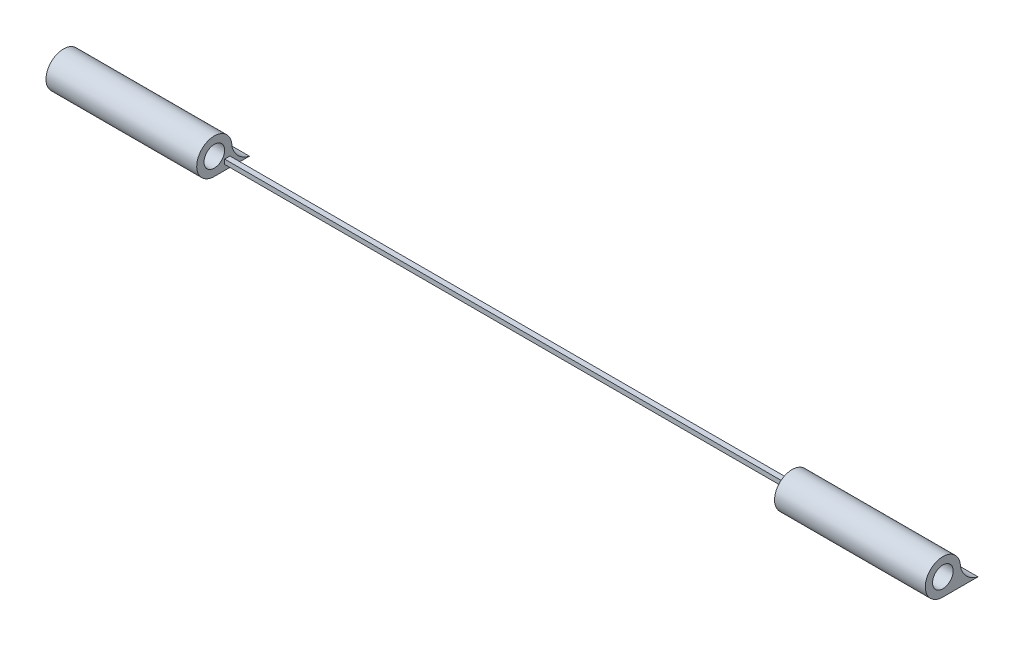
ISO-10303-21;
HEADER;
FILE_DESCRIPTION(('STEP AP214'),'2;1');
FILE_NAME('part.step','',(''),(''),'','','');
FILE_SCHEMA(('AUTOMOTIVE_DESIGN { 1 0 10303 214 1 1 1 1 }'));
ENDSEC;
DATA;
#1=APPLICATION_CONTEXT('core data for automotive mechanical design processes');
#2=APPLICATION_PROTOCOL_DEFINITION('international standard','automotive_design',2000,#1);
#3=PRODUCT_CONTEXT('',#1,'mechanical');
#4=PRODUCT('Part','Part','',(#3));
#5=PRODUCT_RELATED_PRODUCT_CATEGORY('part','',(#4));
#6=PRODUCT_DEFINITION_FORMATION('','',#4);
#7=PRODUCT_DEFINITION_CONTEXT('part definition',#1,'design');
#8=PRODUCT_DEFINITION('design','',#6,#7);
#9=PRODUCT_DEFINITION_SHAPE('','',#8);
#10=(LENGTH_UNIT() NAMED_UNIT(*) SI_UNIT(.MILLI.,.METRE.));
#11=(NAMED_UNIT(*) PLANE_ANGLE_UNIT() SI_UNIT($,.RADIAN.));
#12=(NAMED_UNIT(*) SI_UNIT($,.STERADIAN.) SOLID_ANGLE_UNIT());
#13=UNCERTAINTY_MEASURE_WITH_UNIT(LENGTH_MEASURE(1.E-05),#10,'distance_accuracy_value','');
#14=(GEOMETRIC_REPRESENTATION_CONTEXT(3) GLOBAL_UNCERTAINTY_ASSIGNED_CONTEXT((#13)) GLOBAL_UNIT_ASSIGNED_CONTEXT((#10,
#11,#12)) REPRESENTATION_CONTEXT('',''));
#15=CARTESIAN_POINT('',(0.,0.,0.));
#16=DIRECTION('',(0.,0.,1.));
#17=DIRECTION('',(1.,0.,0.));
#18=AXIS2_PLACEMENT_3D('',#15,#16,#17);
#19=CARTESIAN_POINT('',(-48.,0.,0.));
#20=DIRECTION('',(1.,0.,0.));
#21=DIRECTION('',(0.,0.,-1.));
#22=AXIS2_PLACEMENT_3D('',#19,#20,#21);
#23=PLANE('',#22);
#24=CARTESIAN_POINT('',(-48.,2.69861313868613,72.1941406768414));
#25=DIRECTION('',(1.,0.,0.));
#26=DIRECTION('',(0.,0.,-1.));
#27=AXIS2_PLACEMENT_3D('',#24,#25,#26);
#28=CIRCLE('',#27,0.700000000000002);
#29=CARTESIAN_POINT('',(-48.,2.00032979553038,72.1451470785736));
#30=VERTEX_POINT('',#29);
#31=CARTESIAN_POINT('',(-48.,2.69861313868613,71.4941406768414));
#32=VERTEX_POINT('',#31);
#33=EDGE_CURVE('E47',#30,#32,#28,.F.);
#34=ORIENTED_EDGE('',*,*,#33,.T.);
#35=CARTESIAN_POINT('',(-48.,2.89930656934307,70.5948341074983));
#36=DIRECTION('',(1.,0.,0.));
#37=DIRECTION('',(0.,0.,-1.));
#38=AXIS2_PLACEMENT_3D('',#35,#36,#37);
#39=CIRCLE('',#38,0.921428325358213);
#40=CARTESIAN_POINT('',(-48.,2.,70.7955275381552));
#41=VERTEX_POINT('',#40);
#42=EDGE_CURVE('E211',#32,#41,#39,.T.);
#43=ORIENTED_EDGE('',*,*,#42,.T.);
#44=DIRECTION('',(0.,0.,1.));
#45=VECTOR('',#44,1.);
#46=CARTESIAN_POINT('',(-48.,2.,0.));
#47=LINE('',#46,#45);
#48=CARTESIAN_POINT('',(-48.,2.,72.1451239391562));
#49=VERTEX_POINT('',#48);
#50=EDGE_CURVE('E219',#41,#49,#47,.T.);
#51=ORIENTED_EDGE('',*,*,#50,.T.);
#52=DIRECTION('',(0.,-0.997547633079647,-0.0699908546682587));
#53=VECTOR('',#52,1.);
#54=CARTESIAN_POINT('',(-48.,-5.02731822114554,71.6520667737501));
#55=LINE('',#54,#53);
#56=EDGE_CURVE('E220',#30,#49,#55,.T.);
#57=ORIENTED_EDGE('',*,*,#56,.F.);
#58=EDGE_LOOP('',(#34,#43,#51,#57));
#59=FACE_BOUND('',#58,.T.);
#60=CARTESIAN_POINT('',(-48.,2.69861313868613,72.1941406768414));
#61=DIRECTION('',(1.,0.,0.));
#62=DIRECTION('',(0.,0.,-1.));
#63=AXIS2_PLACEMENT_3D('',#60,#61,#62);
#64=CIRCLE('',#63,0.409999999999988);
#65=CARTESIAN_POINT('',(-48.,2.69861313868613,71.7841406768414));
#66=VERTEX_POINT('',#65);
#67=EDGE_CURVE('E207',#66,#66,#64,.T.);
#68=ORIENTED_EDGE('',*,*,#67,.T.);
#69=EDGE_LOOP('',(#68));
#70=FACE_BOUND('',#69,.T.);
#71=ADVANCED_FACE('F43',(#59,#70),#23,.F.);
#72=CARTESIAN_POINT('',(-4.99999999999999,2.69861313868613,72.1941406768414));
#73=DIRECTION('',(-1.,0.,0.));
#74=DIRECTION('',(0.,0.,1.));
#75=AXIS2_PLACEMENT_3D('',#72,#73,#74);
#76=CYLINDRICAL_SURFACE('',#75,0.700000000000002);
#77=ORIENTED_EDGE('',*,*,#33,.F.);
#78=DIRECTION('',(-1.,0.,0.));
#79=VECTOR('',#78,1.);
#80=CARTESIAN_POINT('',(-4.99999999999999,2.00032979553038,72.1451470785736));
#81=LINE('',#80,#79);
#82=CARTESIAN_POINT('',(-42.,2.00032979553038,72.1451470785736));
#83=VERTEX_POINT('',#82);
#84=EDGE_CURVE('E208',#83,#30,#81,.T.);
#85=ORIENTED_EDGE('',*,*,#84,.F.);
#86=CARTESIAN_POINT('',(-42.,2.69861313868613,72.1941406768414));
#87=DIRECTION('',(1.,0.,0.));
#88=DIRECTION('',(0.,0.,-1.));
#89=AXIS2_PLACEMENT_3D('',#86,#87,#88);
#90=CIRCLE('',#89,0.700000000000002);
#91=CARTESIAN_POINT('',(-42.,2.69861313868613,71.4941406768414));
#92=VERTEX_POINT('',#91);
#93=EDGE_CURVE('E11',#83,#92,#90,.F.);
#94=ORIENTED_EDGE('',*,*,#93,.T.);
#95=DIRECTION('',(-1.,0.,0.));
#96=VECTOR('',#95,1.);
#97=CARTESIAN_POINT('',(-4.99999999999999,2.69861313868613,71.4941406768414));
#98=LINE('',#97,#96);
#99=EDGE_CURVE('E213',#92,#32,#98,.T.);
#100=ORIENTED_EDGE('',*,*,#99,.T.);
#101=EDGE_LOOP('',(#77,#85,#94,#100));
#102=FACE_BOUND('',#101,.T.);
#103=ADVANCED_FACE('F251',(#102),#76,.T.);
#104=CARTESIAN_POINT('',(-42.,0.,0.));
#105=DIRECTION('',(1.,0.,0.));
#106=DIRECTION('',(0.,0.,-1.));
#107=AXIS2_PLACEMENT_3D('',#104,#105,#106);
#108=PLANE('',#107);
#109=ORIENTED_EDGE('',*,*,#93,.F.);
#110=DIRECTION('',(0.,-0.997547633079647,-0.0699908546682587));
#111=VECTOR('',#110,1.);
#112=CARTESIAN_POINT('',(-42.,-5.02731822114554,71.6520667737501));
#113=LINE('',#112,#111);
#114=CARTESIAN_POINT('',(-42.,2.,72.1451239391562));
#115=VERTEX_POINT('',#114);
#116=EDGE_CURVE('E226',#83,#115,#113,.T.);
#117=ORIENTED_EDGE('',*,*,#116,.T.);
#118=DIRECTION('',(0.,0.,1.));
#119=VECTOR('',#118,1.);
#120=CARTESIAN_POINT('',(-42.,2.,0.));
#121=LINE('',#120,#119);
#122=CARTESIAN_POINT('',(-42.,2.,70.7955275381552));
#123=VERTEX_POINT('',#122);
#124=EDGE_CURVE('E184',#123,#115,#121,.T.);
#125=ORIENTED_EDGE('',*,*,#124,.F.);
#126=CARTESIAN_POINT('',(-42.,2.89930656934307,70.5948341074983));
#127=DIRECTION('',(1.,0.,0.));
#128=DIRECTION('',(0.,0.,-1.));
#129=AXIS2_PLACEMENT_3D('',#126,#127,#128);
#130=CIRCLE('',#129,0.921428325358213);
#131=EDGE_CURVE('E223',#92,#123,#130,.T.);
#132=ORIENTED_EDGE('',*,*,#131,.F.);
#133=EDGE_LOOP('',(#109,#117,#125,#132));
#134=FACE_BOUND('',#133,.T.);
#135=CARTESIAN_POINT('',(-42.,2.69861313868613,72.1941406768414));
#136=DIRECTION('',(1.,0.,0.));
#137=DIRECTION('',(0.,0.,-1.));
#138=AXIS2_PLACEMENT_3D('',#135,#136,#137);
#139=CIRCLE('',#138,0.409999999999988);
#140=CARTESIAN_POINT('',(-42.,2.69861313868613,71.7841406768414));
#141=VERTEX_POINT('',#140);
#142=EDGE_CURVE('E204',#141,#141,#139,.T.);
#143=ORIENTED_EDGE('',*,*,#142,.F.);
#144=EDGE_LOOP('',(#143));
#145=FACE_BOUND('',#144,.T.);
#146=DIRECTION('',(0.,-1.,0.));
#147=VECTOR('',#146,1.);
#148=CARTESIAN_POINT('',(-42.,2.39497961892927,71.7841406768414));
#149=LINE('',#148,#147);
#150=CARTESIAN_POINT('',(-42.,2.39497961892927,71.7841406768414));
#151=VERTEX_POINT('',#150);
#152=CARTESIAN_POINT('',(-42.,2.21138820541952,71.7841406768414));
#153=VERTEX_POINT('',#152);
#154=EDGE_CURVE('E168',#151,#153,#149,.T.);
#155=ORIENTED_EDGE('',*,*,#154,.F.);
#156=DIRECTION('',(0.,0.,1.));
#157=VECTOR('',#156,1.);
#158=CARTESIAN_POINT('',(-42.,2.39497961892927,71.7841406768414));
#159=LINE('',#158,#157);
#160=CARTESIAN_POINT('',(-42.,2.39497961892927,71.5729544581436));
#161=VERTEX_POINT('',#160);
#162=EDGE_CURVE('E58',#161,#151,#159,.T.);
#163=ORIENTED_EDGE('',*,*,#162,.F.);
#164=DIRECTION('',(0.,1.,0.));
#165=VECTOR('',#164,1.);
#166=CARTESIAN_POINT('',(-42.,2.39497961892927,71.5729544581436));
#167=LINE('',#166,#165);
#168=CARTESIAN_POINT('',(-42.,2.21138820541952,71.5729544581436));
#169=VERTEX_POINT('',#168);
#170=EDGE_CURVE('E190',#169,#161,#167,.T.);
#171=ORIENTED_EDGE('',*,*,#170,.F.);
#172=DIRECTION('',(0.,0.,-1.));
#173=VECTOR('',#172,1.);
#174=CARTESIAN_POINT('',(-42.,2.21138820541952,71.7841406768414));
#175=LINE('',#174,#173);
#176=EDGE_CURVE('E187',#153,#169,#175,.T.);
#177=ORIENTED_EDGE('',*,*,#176,.F.);
#178=EDGE_LOOP('',(#155,#163,#171,#177));
#179=FACE_BOUND('',#178,.T.);
#180=ADVANCED_FACE('F45',(#134,#145,#179),#108,.T.);
#181=CARTESIAN_POINT('',(0.,2.,0.));
#182=DIRECTION('',(0.,1.,0.));
#183=DIRECTION('',(0.,0.,1.));
#184=AXIS2_PLACEMENT_3D('',#181,#182,#183);
#185=PLANE('',#184);
#186=DIRECTION('',(-1.,0.,0.));
#187=VECTOR('',#186,1.);
#188=CARTESIAN_POINT('',(-4.99999999999999,2.,70.7955275381552));
#189=LINE('',#188,#187);
#190=EDGE_CURVE('E212',#123,#41,#189,.T.);
#191=ORIENTED_EDGE('',*,*,#190,.F.);
#192=ORIENTED_EDGE('',*,*,#124,.T.);
#193=DIRECTION('',(-1.,0.,0.));
#194=VECTOR('',#193,1.);
#195=CARTESIAN_POINT('',(-4.99999999999999,2.,72.1451239391562));
#196=LINE('',#195,#194);
#197=EDGE_CURVE('E216',#115,#49,#196,.T.);
#198=ORIENTED_EDGE('',*,*,#197,.T.);
#199=ORIENTED_EDGE('',*,*,#50,.F.);
#200=EDGE_LOOP('',(#191,#192,#198,#199));
#201=FACE_BOUND('',#200,.T.);
#202=ADVANCED_FACE('F238',(#201),#185,.F.);
#203=CARTESIAN_POINT('',(-56.,2.69861313868613,72.1941406768414));
#204=DIRECTION('',(1.,0.,0.));
#205=DIRECTION('',(0.,0.,-1.));
#206=AXIS2_PLACEMENT_3D('',#203,#204,#205);
#207=CYLINDRICAL_SURFACE('',#206,0.409999999999988);
#208=ORIENTED_EDGE('',*,*,#142,.T.);
#209=EDGE_LOOP('',(#208));
#210=FACE_BOUND('',#209,.T.);
#211=ORIENTED_EDGE('',*,*,#67,.F.);
#212=EDGE_LOOP('',(#211));
#213=FACE_BOUND('',#212,.T.);
#214=ADVANCED_FACE('F260',(#210,#213),#207,.F.);
#215=CARTESIAN_POINT('',(-4.99999999999999,2.89930656934307,70.5948341074983));
#216=DIRECTION('',(-1.,0.,0.));
#217=DIRECTION('',(0.,0.,1.));
#218=AXIS2_PLACEMENT_3D('',#215,#216,#217);
#219=CYLINDRICAL_SURFACE('',#218,0.921428325358213);
#220=ORIENTED_EDGE('',*,*,#42,.F.);
#221=ORIENTED_EDGE('',*,*,#99,.F.);
#222=ORIENTED_EDGE('',*,*,#131,.T.);
#223=ORIENTED_EDGE('',*,*,#190,.T.);
#224=EDGE_LOOP('',(#220,#221,#222,#223));
#225=FACE_BOUND('',#224,.T.);
#226=ADVANCED_FACE('F248',(#225),#219,.F.);
#227=CARTESIAN_POINT('',(-5.,1.00278216245073,72.0751562239053));
#228=DIRECTION('',(0.,-0.0699908546682587,0.997547633079647));
#229=DIRECTION('',(0.,-0.997547633079647,-0.0699908546682587));
#230=AXIS2_PLACEMENT_3D('',#227,#228,#229);
#231=PLANE('',#230);
#232=ORIENTED_EDGE('',*,*,#56,.T.);
#233=ORIENTED_EDGE('',*,*,#197,.F.);
#234=ORIENTED_EDGE('',*,*,#116,.F.);
#235=ORIENTED_EDGE('',*,*,#84,.T.);
#236=EDGE_LOOP('',(#232,#233,#234,#235));
#237=FACE_BOUND('',#236,.T.);
#238=ADVANCED_FACE('F242',(#237),#231,.T.);
#239=CARTESIAN_POINT('',(-18.7201689329571,2.39497961892927,71.7841406768414));
#240=DIRECTION('',(0.,-1.,0.));
#241=DIRECTION('',(0.,0.,-1.));
#242=AXIS2_PLACEMENT_3D('',#239,#240,#241);
#243=PLANE('',#242);
#244=DIRECTION('',(-1.,0.,0.));
#245=VECTOR('',#244,1.);
#246=CARTESIAN_POINT('',(-18.7201689329571,2.39497961892927,71.7841406768414));
#247=LINE('',#246,#245);
#248=CARTESIAN_POINT('',(-19.,2.39497961892927,71.7841406768414));
#249=VERTEX_POINT('',#248);
#250=EDGE_CURVE('E194',#249,#151,#247,.T.);
#251=ORIENTED_EDGE('',*,*,#250,.F.);
#252=DIRECTION('',(0.,0.,-1.));
#253=VECTOR('',#252,1.);
#254=CARTESIAN_POINT('',(-19.,2.39497961892927,71.7841406768414));
#255=LINE('',#254,#253);
#256=CARTESIAN_POINT('',(-19.,2.39497961892927,71.5729544581436));
#257=VERTEX_POINT('',#256);
#258=EDGE_CURVE('E178',#249,#257,#255,.T.);
#259=ORIENTED_EDGE('',*,*,#258,.T.);
#260=DIRECTION('',(-1.,0.,0.));
#261=VECTOR('',#260,1.);
#262=CARTESIAN_POINT('',(-18.7201689329571,2.39497961892927,71.5729544581436));
#263=LINE('',#262,#261);
#264=EDGE_CURVE('E196',#257,#161,#263,.T.);
#265=ORIENTED_EDGE('',*,*,#264,.T.);
#266=ORIENTED_EDGE('',*,*,#162,.T.);
#267=EDGE_LOOP('',(#251,#259,#265,#266));
#268=FACE_BOUND('',#267,.T.);
#269=ADVANCED_FACE('F264',(#268),#243,.F.);
#270=CARTESIAN_POINT('',(-18.7201689329571,2.39497961892927,71.5729544581436));
#271=DIRECTION('',(0.,0.,1.));
#272=DIRECTION('',(1.,0.,0.));
#273=AXIS2_PLACEMENT_3D('',#270,#271,#272);
#274=PLANE('',#273);
#275=ORIENTED_EDGE('',*,*,#264,.F.);
#276=DIRECTION('',(0.,-1.,0.));
#277=VECTOR('',#276,1.);
#278=CARTESIAN_POINT('',(-19.,2.39497961892927,71.5729544581436));
#279=LINE('',#278,#277);
#280=CARTESIAN_POINT('',(-19.,2.21138820541952,71.5729544581436));
#281=VERTEX_POINT('',#280);
#282=EDGE_CURVE('E174',#257,#281,#279,.T.);
#283=ORIENTED_EDGE('',*,*,#282,.T.);
#284=DIRECTION('',(-1.,0.,0.));
#285=VECTOR('',#284,1.);
#286=CARTESIAN_POINT('',(-18.7201689329571,2.21138820541952,71.5729544581436));
#287=LINE('',#286,#285);
#288=EDGE_CURVE('E198',#281,#169,#287,.T.);
#289=ORIENTED_EDGE('',*,*,#288,.T.);
#290=ORIENTED_EDGE('',*,*,#170,.T.);
#291=EDGE_LOOP('',(#275,#283,#289,#290));
#292=FACE_BOUND('',#291,.T.);
#293=ADVANCED_FACE('F278',(#292),#274,.F.);
#294=CARTESIAN_POINT('',(-18.7201689329571,2.21138820541952,71.7841406768414));
#295=DIRECTION('',(0.,1.,0.));
#296=DIRECTION('',(0.,0.,1.));
#297=AXIS2_PLACEMENT_3D('',#294,#295,#296);
#298=PLANE('',#297);
#299=ORIENTED_EDGE('',*,*,#288,.F.);
#300=DIRECTION('',(0.,0.,1.));
#301=VECTOR('',#300,1.);
#302=CARTESIAN_POINT('',(-19.,2.21138820541952,71.7841406768414));
#303=LINE('',#302,#301);
#304=CARTESIAN_POINT('',(-19.,2.21138820541952,71.7841406768414));
#305=VERTEX_POINT('',#304);
#306=EDGE_CURVE('E177',#281,#305,#303,.T.);
#307=ORIENTED_EDGE('',*,*,#306,.T.);
#308=DIRECTION('',(-1.,0.,0.));
#309=VECTOR('',#308,1.);
#310=CARTESIAN_POINT('',(-18.7201689329571,2.21138820541952,71.7841406768414));
#311=LINE('',#310,#309);
#312=EDGE_CURVE('E200',#305,#153,#311,.T.);
#313=ORIENTED_EDGE('',*,*,#312,.T.);
#314=ORIENTED_EDGE('',*,*,#176,.T.);
#315=EDGE_LOOP('',(#299,#307,#313,#314));
#316=FACE_BOUND('',#315,.T.);
#317=ADVANCED_FACE('F274',(#316),#298,.F.);
#318=CARTESIAN_POINT('',(-18.7201689329571,2.39497961892927,71.7841406768414));
#319=DIRECTION('',(0.,0.,-1.));
#320=DIRECTION('',(-1.,0.,0.));
#321=AXIS2_PLACEMENT_3D('',#318,#319,#320);
#322=PLANE('',#321);
#323=ORIENTED_EDGE('',*,*,#312,.F.);
#324=DIRECTION('',(0.,1.,0.));
#325=VECTOR('',#324,1.);
#326=CARTESIAN_POINT('',(-19.,2.39497961892927,71.7841406768414));
#327=LINE('',#326,#325);
#328=EDGE_CURVE('E181',#305,#249,#327,.T.);
#329=ORIENTED_EDGE('',*,*,#328,.T.);
#330=ORIENTED_EDGE('',*,*,#250,.T.);
#331=ORIENTED_EDGE('',*,*,#154,.T.);
#332=EDGE_LOOP('',(#323,#329,#330,#331));
#333=FACE_BOUND('',#332,.T.);
#334=ADVANCED_FACE('F271',(#333),#322,.F.);
#335=CARTESIAN_POINT('',(-19.,0.,0.));
#336=DIRECTION('',(-1.,0.,0.));
#337=DIRECTION('',(0.,0.,1.));
#338=AXIS2_PLACEMENT_3D('',#335,#336,#337);
#339=PLANE('',#338);
#340=CARTESIAN_POINT('',(-19.,2.69861313868613,72.1941406768414));
#341=DIRECTION('',(-1.,0.,0.));
#342=DIRECTION('',(0.,0.,1.));
#343=AXIS2_PLACEMENT_3D('',#340,#341,#342);
#344=CIRCLE('',#343,0.409999999999988);
#345=CARTESIAN_POINT('',(-19.,2.69861313868613,72.6041406768414));
#346=VERTEX_POINT('',#345);
#347=EDGE_CURVE('E160',#346,#346,#344,.T.);
#348=ORIENTED_EDGE('',*,*,#347,.F.);
#349=EDGE_LOOP('',(#348));
#350=FACE_BOUND('',#349,.T.);
#351=CARTESIAN_POINT('',(-19.,2.69861313868613,72.1941406768414));
#352=DIRECTION('',(-1.,0.,0.));
#353=DIRECTION('',(0.,0.,1.));
#354=AXIS2_PLACEMENT_3D('',#351,#352,#353);
#355=CIRCLE('',#354,0.700000000000002);
#356=CARTESIAN_POINT('',(-19.,2.69861313868613,71.4941406768414));
#357=VERTEX_POINT('',#356);
#358=CARTESIAN_POINT('',(-19.,2.00032979553038,72.1451470785736));
#359=VERTEX_POINT('',#358);
#360=EDGE_CURVE('E162',#357,#359,#355,.F.);
#361=ORIENTED_EDGE('',*,*,#360,.F.);
#362=CARTESIAN_POINT('',(-19.,2.89930656934307,70.5948341074983));
#363=DIRECTION('',(-1.,0.,0.));
#364=DIRECTION('',(0.,0.,1.));
#365=AXIS2_PLACEMENT_3D('',#362,#363,#364);
#366=CIRCLE('',#365,0.921428325358213);
#367=CARTESIAN_POINT('',(-19.,2.,70.7955275381552));
#368=VERTEX_POINT('',#367);
#369=EDGE_CURVE('E140',#368,#357,#366,.T.);
#370=ORIENTED_EDGE('',*,*,#369,.F.);
#371=DIRECTION('',(0.,0.,-1.));
#372=VECTOR('',#371,1.);
#373=CARTESIAN_POINT('',(-19.,2.,0.));
#374=LINE('',#373,#372);
#375=CARTESIAN_POINT('',(-19.,2.,72.1451239391562));
#376=VERTEX_POINT('',#375);
#377=EDGE_CURVE('E133',#376,#368,#374,.T.);
#378=ORIENTED_EDGE('',*,*,#377,.F.);
#379=DIRECTION('',(0.,0.997547633079647,0.0699908546682587));
#380=VECTOR('',#379,1.);
#381=CARTESIAN_POINT('',(-19.,-5.02731822114554,71.6520667737501));
#382=LINE('',#381,#380);
#383=EDGE_CURVE('E138',#376,#359,#382,.T.);
#384=ORIENTED_EDGE('',*,*,#383,.T.);
#385=EDGE_LOOP('',(#361,#370,#378,#384));
#386=FACE_BOUND('',#385,.T.);
#387=ORIENTED_EDGE('',*,*,#306,.F.);
#388=ORIENTED_EDGE('',*,*,#282,.F.);
#389=ORIENTED_EDGE('',*,*,#258,.F.);
#390=ORIENTED_EDGE('',*,*,#328,.F.);
#391=EDGE_LOOP('',(#387,#388,#389,#390));
#392=FACE_BOUND('',#391,.T.);
#393=ADVANCED_FACE('F135',(#350,#386,#392),#339,.T.);
#394=CARTESIAN_POINT('',(0.,2.,0.));
#395=DIRECTION('',(0.,1.,0.));
#396=DIRECTION('',(0.,0.,1.));
#397=AXIS2_PLACEMENT_3D('',#394,#395,#396);
#398=PLANE('',#397);
#399=DIRECTION('',(-1.,0.,0.));
#400=VECTOR('',#399,1.);
#401=CARTESIAN_POINT('',(-4.99999999999999,2.,72.1451239391562));
#402=LINE('',#401,#400);
#403=CARTESIAN_POINT('',(-13.,2.,72.1451239391562));
#404=VERTEX_POINT('',#403);
#405=EDGE_CURVE('E143',#404,#376,#402,.T.);
#406=ORIENTED_EDGE('',*,*,#405,.T.);
#407=ORIENTED_EDGE('',*,*,#377,.T.);
#408=DIRECTION('',(-1.,0.,0.));
#409=VECTOR('',#408,1.);
#410=CARTESIAN_POINT('',(-4.99999999999999,2.,70.7955275381552));
#411=LINE('',#410,#409);
#412=CARTESIAN_POINT('',(-13.,2.,70.7955275381552));
#413=VERTEX_POINT('',#412);
#414=EDGE_CURVE('E172',#413,#368,#411,.T.);
#415=ORIENTED_EDGE('',*,*,#414,.F.);
#416=DIRECTION('',(0.,0.,-1.));
#417=VECTOR('',#416,1.);
#418=CARTESIAN_POINT('',(-13.,2.,0.));
#419=LINE('',#418,#417);
#420=EDGE_CURVE('E147',#404,#413,#419,.T.);
#421=ORIENTED_EDGE('',*,*,#420,.F.);
#422=EDGE_LOOP('',(#406,#407,#415,#421));
#423=FACE_BOUND('',#422,.T.);
#424=ADVANCED_FACE('F146',(#423),#398,.F.);
#425=CARTESIAN_POINT('',(-13.,0.,0.));
#426=DIRECTION('',(-1.,0.,0.));
#427=DIRECTION('',(0.,0.,1.));
#428=AXIS2_PLACEMENT_3D('',#425,#426,#427);
#429=PLANE('',#428);
#430=CARTESIAN_POINT('',(-13.,2.69861313868613,72.1941406768414));
#431=DIRECTION('',(-1.,0.,0.));
#432=DIRECTION('',(0.,0.,1.));
#433=AXIS2_PLACEMENT_3D('',#430,#431,#432);
#434=CIRCLE('',#433,0.409999999999988);
#435=CARTESIAN_POINT('',(-13.,2.69861313868613,72.6041406768414));
#436=VERTEX_POINT('',#435);
#437=EDGE_CURVE('E157',#436,#436,#434,.T.);
#438=ORIENTED_EDGE('',*,*,#437,.T.);
#439=EDGE_LOOP('',(#438));
#440=FACE_BOUND('',#439,.T.);
#441=CARTESIAN_POINT('',(-13.,2.69861313868613,72.1941406768414));
#442=DIRECTION('',(-1.,0.,0.));
#443=DIRECTION('',(0.,0.,1.));
#444=AXIS2_PLACEMENT_3D('',#441,#442,#443);
#445=CIRCLE('',#444,0.700000000000002);
#446=CARTESIAN_POINT('',(-13.,2.69861313868613,71.4941406768414));
#447=VERTEX_POINT('',#446);
#448=CARTESIAN_POINT('',(-13.,2.00032979553038,72.1451470785736));
#449=VERTEX_POINT('',#448);
#450=EDGE_CURVE('E170',#447,#449,#445,.F.);
#451=ORIENTED_EDGE('',*,*,#450,.T.);
#452=DIRECTION('',(0.,0.997547633079647,0.0699908546682587));
#453=VECTOR('',#452,1.);
#454=CARTESIAN_POINT('',(-13.,-5.02731822114554,71.6520667737501));
#455=LINE('',#454,#453);
#456=EDGE_CURVE('E317',#404,#449,#455,.T.);
#457=ORIENTED_EDGE('',*,*,#456,.F.);
#458=ORIENTED_EDGE('',*,*,#420,.T.);
#459=CARTESIAN_POINT('',(-13.,2.89930656934307,70.5948341074983));
#460=DIRECTION('',(-1.,0.,0.));
#461=DIRECTION('',(0.,0.,1.));
#462=AXIS2_PLACEMENT_3D('',#459,#460,#461);
#463=CIRCLE('',#462,0.921428325358213);
#464=EDGE_CURVE('E171',#413,#447,#463,.T.);
#465=ORIENTED_EDGE('',*,*,#464,.T.);
#466=EDGE_LOOP('',(#451,#457,#458,#465));
#467=FACE_BOUND('',#466,.T.);
#468=ADVANCED_FACE('F289',(#440,#467),#429,.F.);
#469=CARTESIAN_POINT('',(-56.,2.69861313868613,72.1941406768414));
#470=DIRECTION('',(1.,0.,0.));
#471=DIRECTION('',(0.,0.,-1.));
#472=AXIS2_PLACEMENT_3D('',#469,#470,#471);
#473=CYLINDRICAL_SURFACE('',#472,0.409999999999988);
#474=ORIENTED_EDGE('',*,*,#347,.T.);
#475=EDGE_LOOP('',(#474));
#476=FACE_BOUND('',#475,.T.);
#477=ORIENTED_EDGE('',*,*,#437,.F.);
#478=EDGE_LOOP('',(#477));
#479=FACE_BOUND('',#478,.T.);
#480=ADVANCED_FACE('F285',(#476,#479),#473,.F.);
#481=CARTESIAN_POINT('',(-4.99999999999999,2.69861313868613,72.1941406768414));
#482=DIRECTION('',(-1.,0.,0.));
#483=DIRECTION('',(0.,0.,1.));
#484=AXIS2_PLACEMENT_3D('',#481,#482,#483);
#485=CYLINDRICAL_SURFACE('',#484,0.700000000000002);
#486=DIRECTION('',(-1.,0.,0.));
#487=VECTOR('',#486,1.);
#488=CARTESIAN_POINT('',(-4.99999999999999,2.00032979553038,72.1451470785736));
#489=LINE('',#488,#487);
#490=EDGE_CURVE('E156',#449,#359,#489,.T.);
#491=ORIENTED_EDGE('',*,*,#490,.F.);
#492=ORIENTED_EDGE('',*,*,#450,.F.);
#493=DIRECTION('',(-1.,0.,0.));
#494=VECTOR('',#493,1.);
#495=CARTESIAN_POINT('',(-4.99999999999999,2.69861313868613,71.4941406768414));
#496=LINE('',#495,#494);
#497=EDGE_CURVE('E151',#447,#357,#496,.T.);
#498=ORIENTED_EDGE('',*,*,#497,.T.);
#499=ORIENTED_EDGE('',*,*,#360,.T.);
#500=EDGE_LOOP('',(#491,#492,#498,#499));
#501=FACE_BOUND('',#500,.T.);
#502=ADVANCED_FACE('F288',(#501),#485,.T.);
#503=CARTESIAN_POINT('',(-5.,1.00278216245073,72.0751562239053));
#504=DIRECTION('',(0.,-0.0699908546682587,0.997547633079647));
#505=DIRECTION('',(0.,-0.997547633079647,-0.0699908546682587));
#506=AXIS2_PLACEMENT_3D('',#503,#504,#505);
#507=PLANE('',#506);
#508=ORIENTED_EDGE('',*,*,#456,.T.);
#509=ORIENTED_EDGE('',*,*,#490,.T.);
#510=ORIENTED_EDGE('',*,*,#383,.F.);
#511=ORIENTED_EDGE('',*,*,#405,.F.);
#512=EDGE_LOOP('',(#508,#509,#510,#511));
#513=FACE_BOUND('',#512,.T.);
#514=ADVANCED_FACE('F154',(#513),#507,.T.);
#515=CARTESIAN_POINT('',(-4.99999999999999,2.89930656934307,70.5948341074983));
#516=DIRECTION('',(-1.,0.,0.));
#517=DIRECTION('',(0.,0.,1.));
#518=AXIS2_PLACEMENT_3D('',#515,#516,#517);
#519=CYLINDRICAL_SURFACE('',#518,0.921428325358213);
#520=ORIENTED_EDGE('',*,*,#464,.F.);
#521=ORIENTED_EDGE('',*,*,#414,.T.);
#522=ORIENTED_EDGE('',*,*,#369,.T.);
#523=ORIENTED_EDGE('',*,*,#497,.F.);
#524=EDGE_LOOP('',(#520,#521,#522,#523));
#525=FACE_BOUND('',#524,.T.);
#526=ADVANCED_FACE('F293',(#525),#519,.F.);
#527=CLOSED_SHELL('',(#71,#103,#180,#202,#214,#226,#238,#269,#293,#317,#334,#393,#424,#468,#480,
#502,#514,#526));
#528=MANIFOLD_SOLID_BREP('B2',#527);
#529=ADVANCED_BREP_SHAPE_REPRESENTATION('',(#18,#528),#14);
#530=SHAPE_DEFINITION_REPRESENTATION(#9,#529);
ENDSEC;
END-ISO-10303-21;
